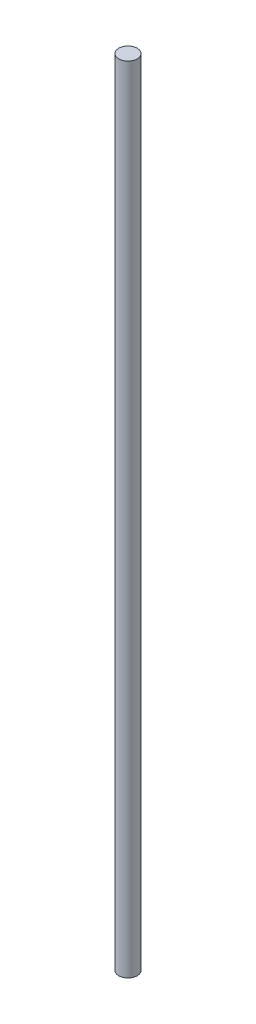
ISO-10303-21;
HEADER;
FILE_DESCRIPTION(('STEP AP214'),'2;1');
FILE_NAME('part.step','',(''),(''),'','','');
FILE_SCHEMA(('AUTOMOTIVE_DESIGN { 1 0 10303 214 1 1 1 1 }'));
ENDSEC;
DATA;
#1=APPLICATION_CONTEXT('core data for automotive mechanical design processes');
#2=APPLICATION_PROTOCOL_DEFINITION('international standard','automotive_design',2000,#1);
#3=PRODUCT_CONTEXT('',#1,'mechanical');
#4=PRODUCT('Part','Part','',(#3));
#5=PRODUCT_RELATED_PRODUCT_CATEGORY('part','',(#4));
#6=PRODUCT_DEFINITION_FORMATION('','',#4);
#7=PRODUCT_DEFINITION_CONTEXT('part definition',#1,'design');
#8=PRODUCT_DEFINITION('design','',#6,#7);
#9=PRODUCT_DEFINITION_SHAPE('','',#8);
#10=(LENGTH_UNIT() NAMED_UNIT(*) SI_UNIT(.MILLI.,.METRE.));
#11=(NAMED_UNIT(*) PLANE_ANGLE_UNIT() SI_UNIT($,.RADIAN.));
#12=(NAMED_UNIT(*) SI_UNIT($,.STERADIAN.) SOLID_ANGLE_UNIT());
#13=UNCERTAINTY_MEASURE_WITH_UNIT(LENGTH_MEASURE(1.E-05),#10,'distance_accuracy_value','');
#14=(GEOMETRIC_REPRESENTATION_CONTEXT(3) GLOBAL_UNCERTAINTY_ASSIGNED_CONTEXT((#13)) GLOBAL_UNIT_ASSIGNED_CONTEXT((#10,
#11,#12)) REPRESENTATION_CONTEXT('',''));
#15=CARTESIAN_POINT('',(0.,0.,0.));
#16=DIRECTION('',(0.,0.,1.));
#17=DIRECTION('',(1.,0.,0.));
#18=AXIS2_PLACEMENT_3D('',#15,#16,#17);
#19=CARTESIAN_POINT('',(0.,342.9,0.));
#20=DIRECTION('',(0.,-1.,0.));
#21=DIRECTION('',(0.,0.,-1.));
#22=AXIS2_PLACEMENT_3D('',#19,#20,#21);
#23=CYLINDRICAL_SURFACE('',#22,3.9878);
#24=CARTESIAN_POINT('',(0.,342.9,0.));
#25=DIRECTION('',(0.,1.,0.));
#26=DIRECTION('',(0.,0.,1.));
#27=AXIS2_PLACEMENT_3D('',#24,#25,#26);
#28=CIRCLE('',#27,3.9878);
#29=CARTESIAN_POINT('',(0.,342.9,3.9878));
#30=VERTEX_POINT('',#29);
#31=EDGE_CURVE('E10',#30,#30,#28,.T.);
#32=ORIENTED_EDGE('',*,*,#31,.F.);
#33=EDGE_LOOP('',(#32));
#34=FACE_BOUND('',#33,.T.);
#35=CARTESIAN_POINT('',(0.,0.,0.));
#36=DIRECTION('',(0.,1.,0.));
#37=DIRECTION('',(0.,0.,1.));
#38=AXIS2_PLACEMENT_3D('',#35,#36,#37);
#39=CIRCLE('',#38,3.9878);
#40=CARTESIAN_POINT('',(0.,0.,3.9878));
#41=VERTEX_POINT('',#40);
#42=EDGE_CURVE('E40',#41,#41,#39,.T.);
#43=ORIENTED_EDGE('',*,*,#42,.T.);
#44=EDGE_LOOP('',(#43));
#45=FACE_BOUND('',#44,.T.);
#46=ADVANCED_FACE('F37',(#34,#45),#23,.T.);
#47=CARTESIAN_POINT('',(0.,342.9,0.));
#48=DIRECTION('',(0.,1.,0.));
#49=DIRECTION('',(0.,0.,1.));
#50=AXIS2_PLACEMENT_3D('',#47,#48,#49);
#51=PLANE('',#50);
#52=ORIENTED_EDGE('',*,*,#31,.T.);
#53=EDGE_LOOP('',(#52));
#54=FACE_BOUND('',#53,.T.);
#55=ADVANCED_FACE('F54',(#54),#51,.T.);
#56=CARTESIAN_POINT('',(0.,0.,0.));
#57=DIRECTION('',(0.,1.,0.));
#58=DIRECTION('',(0.,0.,1.));
#59=AXIS2_PLACEMENT_3D('',#56,#57,#58);
#60=PLANE('',#59);
#61=ORIENTED_EDGE('',*,*,#42,.F.);
#62=EDGE_LOOP('',(#61));
#63=FACE_BOUND('',#62,.T.);
#64=ADVANCED_FACE('F52',(#63),#60,.F.);
#65=CLOSED_SHELL('',(#46,#55,#64));
#66=MANIFOLD_SOLID_BREP('B2',#65);
#67=ADVANCED_BREP_SHAPE_REPRESENTATION('',(#18,#66),#14);
#68=SHAPE_DEFINITION_REPRESENTATION(#9,#67);
ENDSEC;
END-ISO-10303-21;
